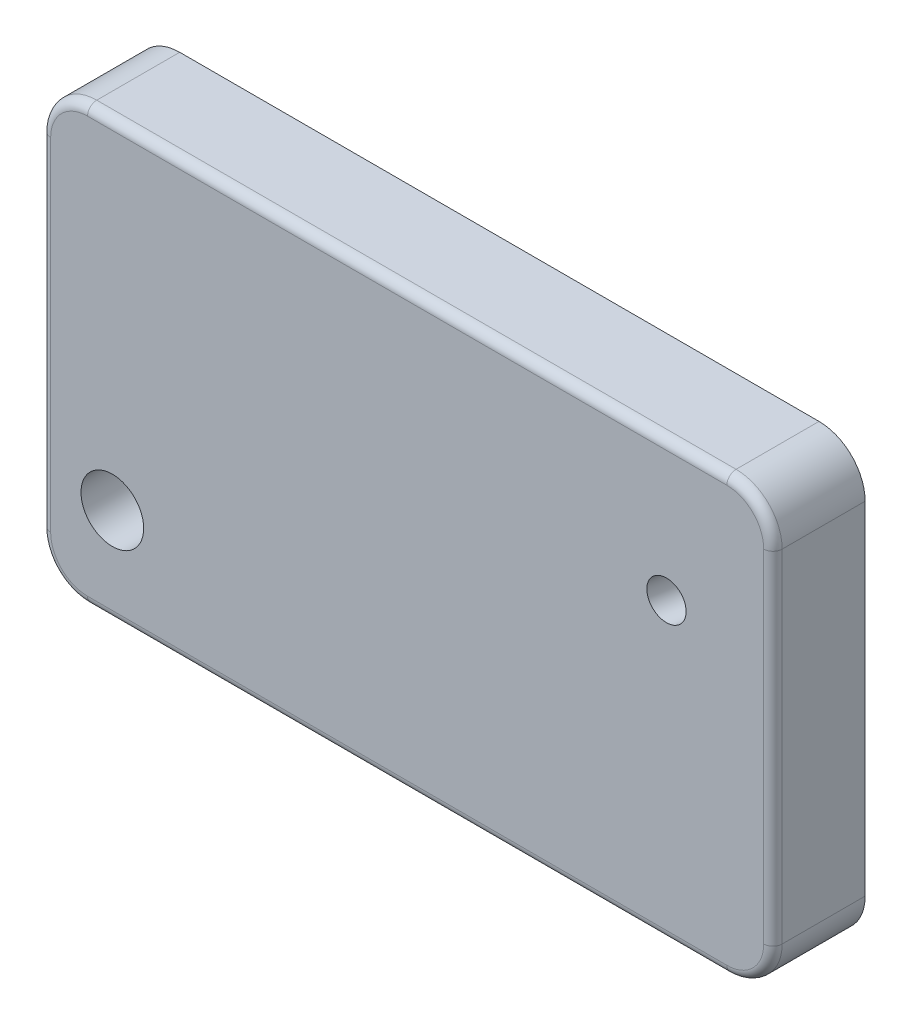
ISO-10303-21;
HEADER;
FILE_DESCRIPTION(('STEP AP214'),'2;1');
FILE_NAME('part.step','',(''),(''),'','','');
FILE_SCHEMA(('AUTOMOTIVE_DESIGN { 1 0 10303 214 1 1 1 1 }'));
ENDSEC;
DATA;
#1=APPLICATION_CONTEXT('core data for automotive mechanical design processes');
#2=APPLICATION_PROTOCOL_DEFINITION('international standard','automotive_design',2000,#1);
#3=PRODUCT_CONTEXT('',#1,'mechanical');
#4=PRODUCT('Part','Part','',(#3));
#5=PRODUCT_RELATED_PRODUCT_CATEGORY('part','',(#4));
#6=PRODUCT_DEFINITION_FORMATION('','',#4);
#7=PRODUCT_DEFINITION_CONTEXT('part definition',#1,'design');
#8=PRODUCT_DEFINITION('design','',#6,#7);
#9=PRODUCT_DEFINITION_SHAPE('','',#8);
#10=(LENGTH_UNIT() NAMED_UNIT(*) SI_UNIT(.MILLI.,.METRE.));
#11=(NAMED_UNIT(*) PLANE_ANGLE_UNIT() SI_UNIT($,.RADIAN.));
#12=(NAMED_UNIT(*) SI_UNIT($,.STERADIAN.) SOLID_ANGLE_UNIT());
#13=UNCERTAINTY_MEASURE_WITH_UNIT(LENGTH_MEASURE(1.E-05),#10,'distance_accuracy_value','');
#14=(GEOMETRIC_REPRESENTATION_CONTEXT(3) GLOBAL_UNCERTAINTY_ASSIGNED_CONTEXT((#13)) GLOBAL_UNIT_ASSIGNED_CONTEXT((#10,
#11,#12)) REPRESENTATION_CONTEXT('',''));
#15=CARTESIAN_POINT('',(0.,0.,0.));
#16=DIRECTION('',(0.,0.,1.));
#17=DIRECTION('',(1.,0.,0.));
#18=AXIS2_PLACEMENT_3D('',#15,#16,#17);
#19=CARTESIAN_POINT('',(0.,0.,0.));
#20=DIRECTION('',(0.,0.,1.));
#21=DIRECTION('',(1.,0.,0.));
#22=AXIS2_PLACEMENT_3D('',#19,#20,#21);
#23=PLANE('',#22);
#24=DIRECTION('',(-1.,0.,0.));
#25=VECTOR('',#24,1.);
#26=CARTESIAN_POINT('',(41.6731279707496,-2.92032989690722,0.));
#27=LINE('',#26,#25);
#28=CARTESIAN_POINT('',(41.6731279707496,-2.92032989690722,0.));
#29=VERTEX_POINT('',#28);
#30=CARTESIAN_POINT('',(24.7071279707496,-2.92032989690722,0.));
#31=VERTEX_POINT('',#30);
#32=EDGE_CURVE('E241',#29,#31,#27,.T.);
#33=ORIENTED_EDGE('',*,*,#32,.F.);
#34=DIRECTION('',(0.,1.,0.));
#35=VECTOR('',#34,1.);
#36=CARTESIAN_POINT('',(41.6731279707496,-2.92032989690722,0.));
#37=LINE('',#36,#35);
#38=CARTESIAN_POINT('',(41.6731279707496,17.0796701030928,0.));
#39=VERTEX_POINT('',#38);
#40=EDGE_CURVE('E265',#29,#39,#37,.T.);
#41=ORIENTED_EDGE('',*,*,#40,.T.);
#42=DIRECTION('',(-1.,0.,0.));
#43=VECTOR('',#42,1.);
#44=CARTESIAN_POINT('',(41.6731279707496,17.0796701030928,0.));
#45=LINE('',#44,#43);
#46=CARTESIAN_POINT('',(24.7071279707496,17.0796701030928,0.));
#47=VERTEX_POINT('',#46);
#48=EDGE_CURVE('E252',#39,#47,#45,.T.);
#49=ORIENTED_EDGE('',*,*,#48,.T.);
#50=DIRECTION('',(0.,1.,0.));
#51=VECTOR('',#50,1.);
#52=CARTESIAN_POINT('',(24.7071279707496,-2.92032989690722,0.));
#53=LINE('',#52,#51);
#54=EDGE_CURVE('E261',#31,#47,#53,.T.);
#55=ORIENTED_EDGE('',*,*,#54,.F.);
#56=EDGE_LOOP('',(#33,#41,#49,#55));
#57=FACE_BOUND('',#56,.T.);
#58=DIRECTION('',(0.,1.,0.));
#59=VECTOR('',#58,1.);
#60=CARTESIAN_POINT('',(-36.3824879725086,0.,0.));
#61=LINE('',#60,#59);
#62=CARTESIAN_POINT('',(-36.3824879725086,-4.37131480412374,0.));
#63=VERTEX_POINT('',#62);
#64=CARTESIAN_POINT('',(-36.3824879725086,17.0796701030928,0.));
#65=VERTEX_POINT('',#64);
#66=EDGE_CURVE('E215',#63,#65,#61,.T.);
#67=ORIENTED_EDGE('',*,*,#66,.T.);
#68=CARTESIAN_POINT('',(-31.3824879725086,17.0796701030928,0.));
#69=DIRECTION('',(0.,0.,1.));
#70=DIRECTION('',(1.,0.,0.));
#71=AXIS2_PLACEMENT_3D('',#68,#69,#70);
#72=CIRCLE('',#71,5.);
#73=CARTESIAN_POINT('',(-31.3824879725086,22.0796701030928,0.));
#74=VERTEX_POINT('',#73);
#75=EDGE_CURVE('E289',#65,#74,#72,.F.);
#76=ORIENTED_EDGE('',*,*,#75,.T.);
#77=DIRECTION('',(1.,0.,0.));
#78=VECTOR('',#77,1.);
#79=CARTESIAN_POINT('',(-49.3824879725086,22.0796701030928,0.));
#80=LINE('',#79,#78);
#81=CARTESIAN_POINT('',(37.9798903107861,22.0796701030928,0.));
#82=VERTEX_POINT('',#81);
#83=EDGE_CURVE('E273',#74,#82,#80,.T.);
#84=ORIENTED_EDGE('',*,*,#83,.T.);
#85=CARTESIAN_POINT('',(37.9798903107861,17.0796701030928,0.));
#86=DIRECTION('',(0.,0.,1.));
#87=DIRECTION('',(1.,0.,0.));
#88=AXIS2_PLACEMENT_3D('',#85,#86,#87);
#89=CIRCLE('',#88,5.);
#90=CARTESIAN_POINT('',(42.9798903107861,17.0796701030928,0.));
#91=VERTEX_POINT('',#90);
#92=EDGE_CURVE('E286',#82,#91,#89,.F.);
#93=ORIENTED_EDGE('',*,*,#92,.T.);
#94=DIRECTION('',(0.,-1.,0.));
#95=VECTOR('',#94,1.);
#96=CARTESIAN_POINT('',(42.9798903107861,22.0796701030928,0.));
#97=LINE('',#96,#95);
#98=CARTESIAN_POINT('',(42.9798903107861,-20.0233148041237,0.));
#99=VERTEX_POINT('',#98);
#100=EDGE_CURVE('E269',#91,#99,#97,.T.);
#101=ORIENTED_EDGE('',*,*,#100,.T.);
#102=CARTESIAN_POINT('',(37.9798903107861,-20.0233148041237,0.));
#103=DIRECTION('',(0.,0.,1.));
#104=DIRECTION('',(1.,0.,0.));
#105=AXIS2_PLACEMENT_3D('',#102,#103,#104);
#106=CIRCLE('',#105,5.);
#107=CARTESIAN_POINT('',(37.9798903107861,-25.0233148041237,0.));
#108=VERTEX_POINT('',#107);
#109=EDGE_CURVE('E283',#99,#108,#106,.F.);
#110=ORIENTED_EDGE('',*,*,#109,.T.);
#111=DIRECTION('',(-1.,0.,0.));
#112=VECTOR('',#111,1.);
#113=CARTESIAN_POINT('',(0.,-25.0233148041237,0.));
#114=LINE('',#113,#112);
#115=CARTESIAN_POINT('',(-15.7304879725086,-25.0233148041237,0.));
#116=VERTEX_POINT('',#115);
#117=EDGE_CURVE('E218',#108,#116,#114,.T.);
#118=ORIENTED_EDGE('',*,*,#117,.T.);
#119=CARTESIAN_POINT('',(-15.7304879725086,-20.0233148041237,0.));
#120=DIRECTION('',(0.,0.,-1.));
#121=DIRECTION('',(1.,0.,0.));
#122=AXIS2_PLACEMENT_3D('',#119,#120,#121);
#123=CIRCLE('',#122,5.);
#124=CARTESIAN_POINT('',(-10.7304879725086,-20.0233148041237,0.));
#125=VERTEX_POINT('',#124);
#126=EDGE_CURVE('E200',#125,#116,#123,.T.);
#127=ORIENTED_EDGE('',*,*,#126,.F.);
#128=DIRECTION('',(0.,-1.,0.));
#129=VECTOR('',#128,1.);
#130=CARTESIAN_POINT('',(-10.7304879725086,-20.0233148041237,0.));
#131=LINE('',#130,#129);
#132=CARTESIAN_POINT('',(-10.7304879725086,-4.37131480412374,0.));
#133=VERTEX_POINT('',#132);
#134=EDGE_CURVE('E430',#133,#125,#131,.T.);
#135=ORIENTED_EDGE('',*,*,#134,.F.);
#136=CARTESIAN_POINT('',(-15.7304879725086,-4.37131480412371,0.));
#137=DIRECTION('',(0.,0.,-1.));
#138=DIRECTION('',(-1.,0.,0.));
#139=AXIS2_PLACEMENT_3D('',#136,#137,#138);
#140=CIRCLE('',#139,5.);
#141=CARTESIAN_POINT('',(-15.7304879725086,0.628685195876293,0.));
#142=VERTEX_POINT('',#141);
#143=EDGE_CURVE('E426',#142,#133,#140,.T.);
#144=ORIENTED_EDGE('',*,*,#143,.F.);
#145=DIRECTION('',(1.,0.,0.));
#146=VECTOR('',#145,1.);
#147=CARTESIAN_POINT('',(-31.3824879725086,0.628685195876294,0.));
#148=LINE('',#147,#146);
#149=CARTESIAN_POINT('',(-31.3824879725086,0.628685195876294,0.));
#150=VERTEX_POINT('',#149);
#151=EDGE_CURVE('E422',#150,#142,#148,.T.);
#152=ORIENTED_EDGE('',*,*,#151,.F.);
#153=CARTESIAN_POINT('',(-31.3824879725086,-4.37131480412371,0.));
#154=DIRECTION('',(0.,0.,-1.));
#155=DIRECTION('',(-1.,0.,0.));
#156=AXIS2_PLACEMENT_3D('',#153,#154,#155);
#157=CIRCLE('',#156,5.);
#158=EDGE_CURVE('E402',#63,#150,#157,.T.);
#159=ORIENTED_EDGE('',*,*,#158,.F.);
#160=EDGE_LOOP('',(#67,#76,#84,#93,#101,#110,#118,#127,#135,#144,#152,#159));
#161=FACE_BOUND('',#160,.T.);
#162=ADVANCED_FACE('F43',(#57,#161),#23,.F.);
#163=CARTESIAN_POINT('',(-49.3824879725086,22.0796701030928,10.));
#164=DIRECTION('',(0.,1.,0.));
#165=DIRECTION('',(0.,0.,1.));
#166=AXIS2_PLACEMENT_3D('',#163,#164,#165);
#167=PLANE('',#166);
#168=DIRECTION('',(0.,0.,-1.));
#169=VECTOR('',#168,1.);
#170=CARTESIAN_POINT('',(-31.3824879725086,22.0796701030928,10.));
#171=LINE('',#170,#169);
#172=CARTESIAN_POINT('',(-31.3824879725086,22.0796701030928,9.));
#173=VERTEX_POINT('',#172);
#174=EDGE_CURVE('E295',#74,#173,#171,.F.);
#175=ORIENTED_EDGE('',*,*,#174,.T.);
#176=DIRECTION('',(1.,0.,0.));
#177=VECTOR('',#176,1.);
#178=CARTESIAN_POINT('',(-49.3824879725086,22.0796701030928,9.));
#179=LINE('',#178,#177);
#180=CARTESIAN_POINT('',(37.9798903107861,22.0796701030928,9.));
#181=VERTEX_POINT('',#180);
#182=EDGE_CURVE('E11',#173,#181,#179,.T.);
#183=ORIENTED_EDGE('',*,*,#182,.T.);
#184=DIRECTION('',(0.,0.,-1.));
#185=VECTOR('',#184,1.);
#186=CARTESIAN_POINT('',(37.9798903107861,22.0796701030928,10.));
#187=LINE('',#186,#185);
#188=EDGE_CURVE('E292',#181,#82,#187,.T.);
#189=ORIENTED_EDGE('',*,*,#188,.T.);
#190=ORIENTED_EDGE('',*,*,#83,.F.);
#191=EDGE_LOOP('',(#175,#183,#189,#190));
#192=FACE_BOUND('',#191,.T.);
#193=ADVANCED_FACE('F494',(#192),#167,.T.);
#194=CARTESIAN_POINT('',(0.,0.,10.));
#195=DIRECTION('',(0.,0.,1.));
#196=DIRECTION('',(1.,0.,0.));
#197=AXIS2_PLACEMENT_3D('',#194,#195,#196);
#198=PLANE('',#197);
#199=DIRECTION('',(1.,0.,0.));
#200=VECTOR('',#199,1.);
#201=CARTESIAN_POINT('',(0.,21.0796701030928,10.));
#202=LINE('',#201,#200);
#203=CARTESIAN_POINT('',(37.9798903107861,21.0796701030928,10.));
#204=VERTEX_POINT('',#203);
#205=CARTESIAN_POINT('',(-31.3824879725086,21.0796701030928,10.));
#206=VERTEX_POINT('',#205);
#207=EDGE_CURVE('E313',#204,#206,#202,.F.);
#208=ORIENTED_EDGE('',*,*,#207,.T.);
#209=CARTESIAN_POINT('',(-31.3824879725086,17.0796701030928,10.));
#210=DIRECTION('',(0.,0.,1.));
#211=DIRECTION('',(1.,0.,0.));
#212=AXIS2_PLACEMENT_3D('',#209,#210,#211);
#213=CIRCLE('',#212,4.);
#214=CARTESIAN_POINT('',(-35.3824879725086,17.0796701030928,10.));
#215=VERTEX_POINT('',#214);
#216=EDGE_CURVE('E334',#206,#215,#213,.T.);
#217=ORIENTED_EDGE('',*,*,#216,.T.);
#218=DIRECTION('',(0.,1.,0.));
#219=VECTOR('',#218,1.);
#220=CARTESIAN_POINT('',(-35.3824879725086,0.,10.));
#221=LINE('',#220,#219);
#222=CARTESIAN_POINT('',(-35.3824879725086,-20.0233148041237,10.));
#223=VERTEX_POINT('',#222);
#224=EDGE_CURVE('E331',#215,#223,#221,.F.);
#225=ORIENTED_EDGE('',*,*,#224,.T.);
#226=CARTESIAN_POINT('',(-31.3824879725086,-20.0233148041237,10.));
#227=DIRECTION('',(0.,0.,1.));
#228=DIRECTION('',(1.,0.,0.));
#229=AXIS2_PLACEMENT_3D('',#226,#227,#228);
#230=CIRCLE('',#229,4.);
#231=CARTESIAN_POINT('',(-31.3824879725086,-24.0233148041237,10.));
#232=VERTEX_POINT('',#231);
#233=EDGE_CURVE('E328',#223,#232,#230,.T.);
#234=ORIENTED_EDGE('',*,*,#233,.T.);
#235=DIRECTION('',(-1.,0.,0.));
#236=VECTOR('',#235,1.);
#237=CARTESIAN_POINT('',(0.,-24.0233148041237,10.));
#238=LINE('',#237,#236);
#239=CARTESIAN_POINT('',(37.9798903107861,-24.0233148041237,10.));
#240=VERTEX_POINT('',#239);
#241=EDGE_CURVE('E325',#232,#240,#238,.F.);
#242=ORIENTED_EDGE('',*,*,#241,.T.);
#243=CARTESIAN_POINT('',(37.9798903107861,-20.0233148041237,10.));
#244=DIRECTION('',(0.,0.,1.));
#245=DIRECTION('',(1.,0.,0.));
#246=AXIS2_PLACEMENT_3D('',#243,#244,#245);
#247=CIRCLE('',#246,4.);
#248=CARTESIAN_POINT('',(41.9798903107861,-20.0233148041237,10.));
#249=VERTEX_POINT('',#248);
#250=EDGE_CURVE('E322',#240,#249,#247,.T.);
#251=ORIENTED_EDGE('',*,*,#250,.T.);
#252=DIRECTION('',(0.,-1.,0.));
#253=VECTOR('',#252,1.);
#254=CARTESIAN_POINT('',(41.9798903107861,0.,10.));
#255=LINE('',#254,#253);
#256=CARTESIAN_POINT('',(41.9798903107861,17.0796701030928,10.));
#257=VERTEX_POINT('',#256);
#258=EDGE_CURVE('E319',#249,#257,#255,.F.);
#259=ORIENTED_EDGE('',*,*,#258,.T.);
#260=CARTESIAN_POINT('',(37.9798903107861,17.0796701030928,10.));
#261=DIRECTION('',(0.,0.,1.));
#262=DIRECTION('',(1.,0.,0.));
#263=AXIS2_PLACEMENT_3D('',#260,#261,#262);
#264=CIRCLE('',#263,4.);
#265=EDGE_CURVE('E316',#257,#204,#264,.T.);
#266=ORIENTED_EDGE('',*,*,#265,.T.);
#267=EDGE_LOOP('',(#208,#217,#225,#234,#242,#251,#259,#266));
#268=FACE_BOUND('',#267,.T.);
#269=CARTESIAN_POINT('',(-28.6924879725086,-14.6103298969072,10.));
#270=DIRECTION('',(0.,0.,1.));
#271=DIRECTION('',(1.,0.,0.));
#272=AXIS2_PLACEMENT_3D('',#269,#270,#271);
#273=CIRCLE('',#272,3.4);
#274=CARTESIAN_POINT('',(-25.2924879725086,-14.6103298969072,10.));
#275=VERTEX_POINT('',#274);
#276=EDGE_CURVE('E389',#275,#275,#273,.T.);
#277=ORIENTED_EDGE('',*,*,#276,.F.);
#278=EDGE_LOOP('',(#277));
#279=FACE_BOUND('',#278,.T.);
#280=CARTESIAN_POINT('',(31.426858163665,6.9926873857404,10.));
#281=DIRECTION('',(0.,0.,1.));
#282=DIRECTION('',(1.,0.,0.));
#283=AXIS2_PLACEMENT_3D('',#280,#281,#282);
#284=ELLIPSE('',#283,2.13239588496006,2.1);
#285=CARTESIAN_POINT('',(33.559254048625,6.9926873857404,10.));
#286=VERTEX_POINT('',#285);
#287=EDGE_CURVE('E233',#286,#286,#284,.T.);
#288=ORIENTED_EDGE('',*,*,#287,.F.);
#289=EDGE_LOOP('',(#288));
#290=FACE_BOUND('',#289,.T.);
#291=ADVANCED_FACE('F519',(#268,#279,#290),#198,.T.);
#292=CARTESIAN_POINT('',(42.9798903107861,22.0796701030928,10.));
#293=DIRECTION('',(1.,0.,0.));
#294=DIRECTION('',(0.,1.,0.));
#295=AXIS2_PLACEMENT_3D('',#292,#293,#294);
#296=PLANE('',#295);
#297=DIRECTION('',(0.,0.,-1.));
#298=VECTOR('',#297,1.);
#299=CARTESIAN_POINT('',(42.9798903107861,17.0796701030928,10.));
#300=LINE('',#299,#298);
#301=CARTESIAN_POINT('',(42.9798903107861,17.0796701030928,9.));
#302=VERTEX_POINT('',#301);
#303=EDGE_CURVE('E301',#91,#302,#300,.F.);
#304=ORIENTED_EDGE('',*,*,#303,.T.);
#305=DIRECTION('',(0.,-1.,0.));
#306=VECTOR('',#305,1.);
#307=CARTESIAN_POINT('',(42.9798903107861,22.0796701030928,9.));
#308=LINE('',#307,#306);
#309=CARTESIAN_POINT('',(42.9798903107861,-20.0233148041237,9.));
#310=VERTEX_POINT('',#309);
#311=EDGE_CURVE('E354',#302,#310,#308,.T.);
#312=ORIENTED_EDGE('',*,*,#311,.T.);
#313=DIRECTION('',(0.,0.,-1.));
#314=VECTOR('',#313,1.);
#315=CARTESIAN_POINT('',(42.9798903107861,-20.0233148041237,10.));
#316=LINE('',#315,#314);
#317=EDGE_CURVE('E298',#310,#99,#316,.T.);
#318=ORIENTED_EDGE('',*,*,#317,.T.);
#319=ORIENTED_EDGE('',*,*,#100,.F.);
#320=EDGE_LOOP('',(#304,#312,#318,#319));
#321=FACE_BOUND('',#320,.T.);
#322=ADVANCED_FACE('F498',(#321),#296,.T.);
#323=CARTESIAN_POINT('',(24.7071279707496,-2.92032989690722,-2.9915635546997));
#324=DIRECTION('',(-0.173648177666924,0.,0.984807753012209));
#325=DIRECTION('',(0.984807753012209,0.,0.173648177666924));
#326=AXIS2_PLACEMENT_3D('',#323,#324,#325);
#327=PLANE('',#326);
#328=CARTESIAN_POINT('',(33.4459217196861,6.9926873857404,-1.45067843791577));
#329=DIRECTION('',(0.173648177666924,0.,-0.984807753012209));
#330=DIRECTION('',(-0.984807753012209,0.,-0.173648177666924));
#331=AXIS2_PLACEMENT_3D('',#328,#329,#330);
#332=CIRCLE('',#331,2.1);
#333=CARTESIAN_POINT('',(31.3778254383605,6.9926873857404,-1.81533961101631));
#334=VERTEX_POINT('',#333);
#335=EDGE_CURVE('E229',#334,#334,#332,.T.);
#336=ORIENTED_EDGE('',*,*,#335,.F.);
#337=EDGE_LOOP('',(#336));
#338=FACE_BOUND('',#337,.T.);
#339=DIRECTION('',(0.984807753012209,0.,0.173648177666924));
#340=VECTOR('',#339,1.);
#341=CARTESIAN_POINT('',(24.7071279707496,17.0796701030928,-2.9915635546997));
#342=LINE('',#341,#340);
#343=CARTESIAN_POINT('',(24.7071279707496,17.0796701030928,-2.9915635546997));
#344=VERTEX_POINT('',#343);
#345=EDGE_CURVE('E237',#344,#39,#342,.T.);
#346=ORIENTED_EDGE('',*,*,#345,.T.);
#347=ORIENTED_EDGE('',*,*,#40,.F.);
#348=DIRECTION('',(0.984807753012209,0.,0.173648177666924));
#349=VECTOR('',#348,1.);
#350=CARTESIAN_POINT('',(24.7071279707496,-2.92032989690722,-2.9915635546997));
#351=LINE('',#350,#349);
#352=CARTESIAN_POINT('',(24.7071279707496,-2.92032989690722,-2.9915635546997));
#353=VERTEX_POINT('',#352);
#354=EDGE_CURVE('E238',#353,#29,#351,.T.);
#355=ORIENTED_EDGE('',*,*,#354,.F.);
#356=DIRECTION('',(0.,1.,0.));
#357=VECTOR('',#356,1.);
#358=CARTESIAN_POINT('',(24.7071279707496,-2.92032989690722,-2.9915635546997));
#359=LINE('',#358,#357);
#360=EDGE_CURVE('E248',#353,#344,#359,.T.);
#361=ORIENTED_EDGE('',*,*,#360,.T.);
#362=EDGE_LOOP('',(#346,#347,#355,#361));
#363=FACE_BOUND('',#362,.T.);
#364=ADVANCED_FACE('F526',(#338,#363),#327,.F.);
#365=CARTESIAN_POINT('',(24.7071279707496,-2.92032989690722,0.));
#366=DIRECTION('',(1.,0.,0.));
#367=DIRECTION('',(0.,0.,-1.));
#368=AXIS2_PLACEMENT_3D('',#365,#366,#367);
#369=PLANE('',#368);
#370=DIRECTION('',(0.,0.,-1.));
#371=VECTOR('',#370,1.);
#372=CARTESIAN_POINT('',(24.7071279707496,17.0796701030928,0.));
#373=LINE('',#372,#371);
#374=EDGE_CURVE('E242',#47,#344,#373,.T.);
#375=ORIENTED_EDGE('',*,*,#374,.T.);
#376=ORIENTED_EDGE('',*,*,#360,.F.);
#377=DIRECTION('',(0.,0.,-1.));
#378=VECTOR('',#377,1.);
#379=CARTESIAN_POINT('',(24.7071279707496,-2.92032989690722,0.));
#380=LINE('',#379,#378);
#381=EDGE_CURVE('E245',#31,#353,#380,.T.);
#382=ORIENTED_EDGE('',*,*,#381,.F.);
#383=ORIENTED_EDGE('',*,*,#54,.T.);
#384=EDGE_LOOP('',(#375,#376,#382,#383));
#385=FACE_BOUND('',#384,.T.);
#386=ADVANCED_FACE('F531',(#385),#369,.F.);
#387=CARTESIAN_POINT('',(0.,-2.92032989690722,0.));
#388=DIRECTION('',(0.,1.,0.));
#389=DIRECTION('',(0.,0.,1.));
#390=AXIS2_PLACEMENT_3D('',#387,#388,#389);
#391=PLANE('',#390);
#392=ORIENTED_EDGE('',*,*,#354,.T.);
#393=ORIENTED_EDGE('',*,*,#32,.T.);
#394=ORIENTED_EDGE('',*,*,#381,.T.);
#395=EDGE_LOOP('',(#392,#393,#394));
#396=FACE_BOUND('',#395,.T.);
#397=ADVANCED_FACE('F556',(#396),#391,.F.);
#398=CARTESIAN_POINT('',(0.,17.0796701030928,0.));
#399=DIRECTION('',(0.,1.,0.));
#400=DIRECTION('',(0.,0.,1.));
#401=AXIS2_PLACEMENT_3D('',#398,#399,#400);
#402=PLANE('',#401);
#403=ORIENTED_EDGE('',*,*,#345,.F.);
#404=ORIENTED_EDGE('',*,*,#374,.F.);
#405=ORIENTED_EDGE('',*,*,#48,.F.);
#406=EDGE_LOOP('',(#403,#404,#405));
#407=FACE_BOUND('',#406,.T.);
#408=ADVANCED_FACE('F544',(#407),#402,.T.);
#409=CARTESIAN_POINT('',(33.4459217196861,6.9926873857404,-1.45067843791577));
#410=DIRECTION('',(0.173648177666924,0.,-0.984807753012209));
#411=DIRECTION('',(-0.984807753012209,0.,-0.173648177666924));
#412=AXIS2_PLACEMENT_3D('',#409,#410,#411);
#413=CYLINDRICAL_SURFACE('',#412,2.1);
#414=ORIENTED_EDGE('',*,*,#287,.T.);
#415=EDGE_LOOP('',(#414));
#416=FACE_BOUND('',#415,.T.);
#417=ORIENTED_EDGE('',*,*,#335,.T.);
#418=EDGE_LOOP('',(#417));
#419=FACE_BOUND('',#418,.T.);
#420=ADVANCED_FACE('F541',(#416,#419),#413,.F.);
#421=CARTESIAN_POINT('',(0.,-25.0233148041237,10.));
#422=DIRECTION('',(0.,-1.,0.));
#423=DIRECTION('',(0.,0.,-1.));
#424=AXIS2_PLACEMENT_3D('',#421,#422,#423);
#425=PLANE('',#424);
#426=DIRECTION('',(0.,0.,-1.));
#427=VECTOR('',#426,1.);
#428=CARTESIAN_POINT('',(37.9798903107861,-25.0233148041237,10.));
#429=LINE('',#428,#427);
#430=CARTESIAN_POINT('',(37.9798903107861,-25.0233148041237,9.));
#431=VERTEX_POINT('',#430);
#432=EDGE_CURVE('E307',#108,#431,#429,.F.);
#433=ORIENTED_EDGE('',*,*,#432,.T.);
#434=DIRECTION('',(-1.,0.,0.));
#435=VECTOR('',#434,1.);
#436=CARTESIAN_POINT('',(0.,-25.0233148041237,9.));
#437=LINE('',#436,#435);
#438=CARTESIAN_POINT('',(-31.3824879725086,-25.0233148041237,9.));
#439=VERTEX_POINT('',#438);
#440=EDGE_CURVE('E348',#431,#439,#437,.T.);
#441=ORIENTED_EDGE('',*,*,#440,.T.);
#442=DIRECTION('',(0.,0.,-1.));
#443=VECTOR('',#442,1.);
#444=CARTESIAN_POINT('',(-31.3824879725086,-25.0233148041237,10.));
#445=LINE('',#444,#443);
#446=CARTESIAN_POINT('',(-31.3824879725086,-25.0233148041237,-20.));
#447=VERTEX_POINT('',#446);
#448=EDGE_CURVE('E304',#439,#447,#445,.T.);
#449=ORIENTED_EDGE('',*,*,#448,.T.);
#450=DIRECTION('',(-1.,0.,0.));
#451=VECTOR('',#450,1.);
#452=CARTESIAN_POINT('',(-36.3824879725086,-25.0233148041237,-20.));
#453=LINE('',#452,#451);
#454=CARTESIAN_POINT('',(-15.7304879725086,-25.0233148041237,-20.));
#455=VERTEX_POINT('',#454);
#456=EDGE_CURVE('E416',#455,#447,#453,.T.);
#457=ORIENTED_EDGE('',*,*,#456,.F.);
#458=DIRECTION('',(0.,0.,1.));
#459=VECTOR('',#458,1.);
#460=CARTESIAN_POINT('',(-15.7304879725086,-25.0233148041237,-20.));
#461=LINE('',#460,#459);
#462=EDGE_CURVE('E419',#455,#116,#461,.T.);
#463=ORIENTED_EDGE('',*,*,#462,.T.);
#464=ORIENTED_EDGE('',*,*,#117,.F.);
#465=EDGE_LOOP('',(#433,#441,#449,#457,#463,#464));
#466=FACE_BOUND('',#465,.T.);
#467=ADVANCED_FACE('F467',(#466),#425,.T.);
#468=CARTESIAN_POINT('',(-36.3824879725086,0.,10.));
#469=DIRECTION('',(-1.,0.,0.));
#470=DIRECTION('',(0.,0.,1.));
#471=AXIS2_PLACEMENT_3D('',#468,#469,#470);
#472=PLANE('',#471);
#473=DIRECTION('',(0.,0.,-1.));
#474=VECTOR('',#473,1.);
#475=CARTESIAN_POINT('',(-36.3824879725086,-20.0233148041237,10.));
#476=LINE('',#475,#474);
#477=CARTESIAN_POINT('',(-36.3824879725086,-20.0233148041237,-20.));
#478=VERTEX_POINT('',#477);
#479=CARTESIAN_POINT('',(-36.3824879725086,-20.0233148041237,9.));
#480=VERTEX_POINT('',#479);
#481=EDGE_CURVE('E277',#478,#480,#476,.F.);
#482=ORIENTED_EDGE('',*,*,#481,.T.);
#483=DIRECTION('',(0.,1.,0.));
#484=VECTOR('',#483,1.);
#485=CARTESIAN_POINT('',(-36.3824879725086,0.,9.));
#486=LINE('',#485,#484);
#487=CARTESIAN_POINT('',(-36.3824879725086,17.0796701030928,9.));
#488=VERTEX_POINT('',#487);
#489=EDGE_CURVE('E342',#480,#488,#486,.T.);
#490=ORIENTED_EDGE('',*,*,#489,.T.);
#491=DIRECTION('',(0.,0.,-1.));
#492=VECTOR('',#491,1.);
#493=CARTESIAN_POINT('',(-36.3824879725086,17.0796701030928,10.));
#494=LINE('',#493,#492);
#495=EDGE_CURVE('E280',#488,#65,#494,.T.);
#496=ORIENTED_EDGE('',*,*,#495,.T.);
#497=ORIENTED_EDGE('',*,*,#66,.F.);
#498=DIRECTION('',(0.,0.,1.));
#499=VECTOR('',#498,1.);
#500=CARTESIAN_POINT('',(-36.3824879725086,-4.37131480412374,-20.));
#501=LINE('',#500,#499);
#502=CARTESIAN_POINT('',(-36.3824879725086,-4.37131480412374,-20.));
#503=VERTEX_POINT('',#502);
#504=EDGE_CURVE('E206',#503,#63,#501,.T.);
#505=ORIENTED_EDGE('',*,*,#504,.F.);
#506=DIRECTION('',(0.,1.,0.));
#507=VECTOR('',#506,1.);
#508=CARTESIAN_POINT('',(-36.3824879725086,-25.0233148041237,-20.));
#509=LINE('',#508,#507);
#510=EDGE_CURVE('E187',#478,#503,#509,.T.);
#511=ORIENTED_EDGE('',*,*,#510,.F.);
#512=EDGE_LOOP('',(#482,#490,#496,#497,#505,#511));
#513=FACE_BOUND('',#512,.T.);
#514=ADVANCED_FACE('F213',(#513),#472,.T.);
#515=CARTESIAN_POINT('',(-31.3824879725086,-4.37131480412371,-20.));
#516=DIRECTION('',(0.,0.,1.));
#517=DIRECTION('',(1.,0.,0.));
#518=AXIS2_PLACEMENT_3D('',#515,#516,#517);
#519=CYLINDRICAL_SURFACE('',#518,5.);
#520=ORIENTED_EDGE('',*,*,#158,.T.);
#521=DIRECTION('',(0.,0.,1.));
#522=VECTOR('',#521,1.);
#523=CARTESIAN_POINT('',(-31.3824879725086,0.628685195876294,-20.));
#524=LINE('',#523,#522);
#525=CARTESIAN_POINT('',(-31.3824879725086,0.628685195876294,-20.));
#526=VERTEX_POINT('',#525);
#527=EDGE_CURVE('E208',#526,#150,#524,.T.);
#528=ORIENTED_EDGE('',*,*,#527,.F.);
#529=CARTESIAN_POINT('',(-31.3824879725086,-4.37131480412371,-20.));
#530=DIRECTION('',(0.,0.,-1.));
#531=DIRECTION('',(-1.,0.,0.));
#532=AXIS2_PLACEMENT_3D('',#529,#530,#531);
#533=CIRCLE('',#532,5.);
#534=EDGE_CURVE('E191',#503,#526,#533,.T.);
#535=ORIENTED_EDGE('',*,*,#534,.F.);
#536=ORIENTED_EDGE('',*,*,#504,.T.);
#537=EDGE_LOOP('',(#520,#528,#535,#536));
#538=FACE_BOUND('',#537,.T.);
#539=ADVANCED_FACE('F205',(#538),#519,.T.);
#540=CARTESIAN_POINT('',(-31.3824879725086,0.628685195876294,-20.));
#541=DIRECTION('',(0.,-1.,0.));
#542=DIRECTION('',(1.,0.,0.));
#543=AXIS2_PLACEMENT_3D('',#540,#541,#542);
#544=PLANE('',#543);
#545=ORIENTED_EDGE('',*,*,#151,.T.);
#546=DIRECTION('',(0.,0.,1.));
#547=VECTOR('',#546,1.);
#548=CARTESIAN_POINT('',(-15.7304879725086,0.628685195876293,-20.));
#549=LINE('',#548,#547);
#550=CARTESIAN_POINT('',(-15.7304879725086,0.628685195876293,-20.));
#551=VERTEX_POINT('',#550);
#552=EDGE_CURVE('E223',#551,#142,#549,.T.);
#553=ORIENTED_EDGE('',*,*,#552,.F.);
#554=DIRECTION('',(1.,0.,0.));
#555=VECTOR('',#554,1.);
#556=CARTESIAN_POINT('',(-31.3824879725086,0.628685195876294,-20.));
#557=LINE('',#556,#555);
#558=EDGE_CURVE('E211',#526,#551,#557,.T.);
#559=ORIENTED_EDGE('',*,*,#558,.F.);
#560=ORIENTED_EDGE('',*,*,#527,.T.);
#561=EDGE_LOOP('',(#545,#553,#559,#560));
#562=FACE_BOUND('',#561,.T.);
#563=ADVANCED_FACE('F455',(#562),#544,.F.);
#564=CARTESIAN_POINT('',(-15.7304879725086,-4.37131480412371,-20.));
#565=DIRECTION('',(0.,0.,1.));
#566=DIRECTION('',(1.,0.,0.));
#567=AXIS2_PLACEMENT_3D('',#564,#565,#566);
#568=CYLINDRICAL_SURFACE('',#567,5.);
#569=ORIENTED_EDGE('',*,*,#143,.T.);
#570=DIRECTION('',(0.,0.,1.));
#571=VECTOR('',#570,1.);
#572=CARTESIAN_POINT('',(-10.7304879725086,-4.37131480412374,-20.));
#573=LINE('',#572,#571);
#574=CARTESIAN_POINT('',(-10.7304879725086,-4.37131480412374,-20.));
#575=VERTEX_POINT('',#574);
#576=EDGE_CURVE('E444',#575,#133,#573,.T.);
#577=ORIENTED_EDGE('',*,*,#576,.F.);
#578=CARTESIAN_POINT('',(-15.7304879725086,-4.37131480412371,-20.));
#579=DIRECTION('',(0.,0.,-1.));
#580=DIRECTION('',(-1.,0.,0.));
#581=AXIS2_PLACEMENT_3D('',#578,#579,#580);
#582=CIRCLE('',#581,5.);
#583=EDGE_CURVE('E407',#551,#575,#582,.T.);
#584=ORIENTED_EDGE('',*,*,#583,.F.);
#585=ORIENTED_EDGE('',*,*,#552,.T.);
#586=EDGE_LOOP('',(#569,#577,#584,#585));
#587=FACE_BOUND('',#586,.T.);
#588=ADVANCED_FACE('F452',(#587),#568,.T.);
#589=CARTESIAN_POINT('',(-10.7304879725086,-20.0233148041237,-20.));
#590=DIRECTION('',(-1.,0.,0.));
#591=DIRECTION('',(0.,0.,1.));
#592=AXIS2_PLACEMENT_3D('',#589,#590,#591);
#593=PLANE('',#592);
#594=ORIENTED_EDGE('',*,*,#134,.T.);
#595=DIRECTION('',(0.,0.,1.));
#596=VECTOR('',#595,1.);
#597=CARTESIAN_POINT('',(-10.7304879725086,-20.0233148041237,-20.));
#598=LINE('',#597,#596);
#599=CARTESIAN_POINT('',(-10.7304879725086,-20.0233148041237,-20.));
#600=VERTEX_POINT('',#599);
#601=EDGE_CURVE('E440',#600,#125,#598,.T.);
#602=ORIENTED_EDGE('',*,*,#601,.F.);
#603=DIRECTION('',(0.,-1.,0.));
#604=VECTOR('',#603,1.);
#605=CARTESIAN_POINT('',(-10.7304879725086,-20.0233148041237,-20.));
#606=LINE('',#605,#604);
#607=EDGE_CURVE('E410',#575,#600,#606,.T.);
#608=ORIENTED_EDGE('',*,*,#607,.F.);
#609=ORIENTED_EDGE('',*,*,#576,.T.);
#610=EDGE_LOOP('',(#594,#602,#608,#609));
#611=FACE_BOUND('',#610,.T.);
#612=ADVANCED_FACE('F459',(#611),#593,.F.);
#613=CARTESIAN_POINT('',(-15.7304879725086,-20.0233148041237,-20.));
#614=DIRECTION('',(0.,0.,1.));
#615=DIRECTION('',(1.,0.,0.));
#616=AXIS2_PLACEMENT_3D('',#613,#614,#615);
#617=CYLINDRICAL_SURFACE('',#616,5.);
#618=ORIENTED_EDGE('',*,*,#126,.T.);
#619=ORIENTED_EDGE('',*,*,#462,.F.);
#620=CARTESIAN_POINT('',(-15.7304879725086,-20.0233148041237,-20.));
#621=DIRECTION('',(0.,0.,-1.));
#622=DIRECTION('',(1.,0.,0.));
#623=AXIS2_PLACEMENT_3D('',#620,#621,#622);
#624=CIRCLE('',#623,5.);
#625=EDGE_CURVE('E413',#600,#455,#624,.T.);
#626=ORIENTED_EDGE('',*,*,#625,.F.);
#627=ORIENTED_EDGE('',*,*,#601,.T.);
#628=EDGE_LOOP('',(#618,#619,#626,#627));
#629=FACE_BOUND('',#628,.T.);
#630=ADVANCED_FACE('F463',(#629),#617,.T.);
#631=CARTESIAN_POINT('',(-31.3824879725086,-4.37131480412371,-20.));
#632=DIRECTION('',(0.,0.,-1.));
#633=DIRECTION('',(-1.,0.,0.));
#634=AXIS2_PLACEMENT_3D('',#631,#632,#633);
#635=PLANE('',#634);
#636=CARTESIAN_POINT('',(-28.6924879725086,-14.6103298969072,-20.));
#637=DIRECTION('',(0.,0.,1.));
#638=DIRECTION('',(1.,0.,0.));
#639=AXIS2_PLACEMENT_3D('',#636,#637,#638);
#640=CIRCLE('',#639,3.39999999999999);
#641=CARTESIAN_POINT('',(-25.2924879725086,-14.6103298969072,-20.));
#642=VERTEX_POINT('',#641);
#643=EDGE_CURVE('E396',#642,#642,#640,.T.);
#644=ORIENTED_EDGE('',*,*,#643,.T.);
#645=EDGE_LOOP('',(#644));
#646=FACE_BOUND('',#645,.T.);
#647=ORIENTED_EDGE('',*,*,#456,.T.);
#648=CARTESIAN_POINT('',(-31.3824879725086,-20.0233148041237,-20.));
#649=DIRECTION('',(0.,0.,-1.));
#650=DIRECTION('',(-1.,0.,0.));
#651=AXIS2_PLACEMENT_3D('',#648,#649,#650);
#652=CIRCLE('',#651,5.);
#653=EDGE_CURVE('E194',#447,#478,#652,.T.);
#654=ORIENTED_EDGE('',*,*,#653,.T.);
#655=ORIENTED_EDGE('',*,*,#510,.T.);
#656=ORIENTED_EDGE('',*,*,#534,.T.);
#657=ORIENTED_EDGE('',*,*,#558,.T.);
#658=ORIENTED_EDGE('',*,*,#583,.T.);
#659=ORIENTED_EDGE('',*,*,#607,.T.);
#660=ORIENTED_EDGE('',*,*,#625,.T.);
#661=EDGE_LOOP('',(#647,#654,#655,#656,#657,#658,#659,#660));
#662=FACE_BOUND('',#661,.T.);
#663=ADVANCED_FACE('F190',(#646,#662),#635,.T.);
#664=CARTESIAN_POINT('',(-28.6924879725086,-14.6103298969072,10.));
#665=DIRECTION('',(0.,0.,1.));
#666=DIRECTION('',(1.,0.,0.));
#667=AXIS2_PLACEMENT_3D('',#664,#665,#666);
#668=CYLINDRICAL_SURFACE('',#667,3.4);
#669=ORIENTED_EDGE('',*,*,#643,.F.);
#670=EDGE_LOOP('',(#669));
#671=FACE_BOUND('',#670,.T.);
#672=ORIENTED_EDGE('',*,*,#276,.T.);
#673=EDGE_LOOP('',(#672));
#674=FACE_BOUND('',#673,.T.);
#675=ADVANCED_FACE('F511',(#671,#674),#668,.F.);
#676=CARTESIAN_POINT('',(-31.3824879725086,17.0796701030928,10.));
#677=DIRECTION('',(0.,0.,-1.));
#678=DIRECTION('',(-1.,0.,0.));
#679=AXIS2_PLACEMENT_3D('',#676,#677,#678);
#680=CYLINDRICAL_SURFACE('',#679,5.);
#681=ORIENTED_EDGE('',*,*,#495,.F.);
#682=CARTESIAN_POINT('',(-31.3824879725086,17.0796701030928,9.));
#683=DIRECTION('',(0.,0.,1.));
#684=DIRECTION('',(1.,0.,0.));
#685=AXIS2_PLACEMENT_3D('',#682,#683,#684);
#686=CIRCLE('',#685,5.);
#687=EDGE_CURVE('E338',#488,#173,#686,.F.);
#688=ORIENTED_EDGE('',*,*,#687,.T.);
#689=ORIENTED_EDGE('',*,*,#174,.F.);
#690=ORIENTED_EDGE('',*,*,#75,.F.);
#691=EDGE_LOOP('',(#681,#688,#689,#690));
#692=FACE_BOUND('',#691,.T.);
#693=ADVANCED_FACE('F491',(#692),#680,.T.);
#694=CARTESIAN_POINT('',(37.9798903107861,17.0796701030928,10.));
#695=DIRECTION('',(0.,0.,-1.));
#696=DIRECTION('',(-1.,0.,0.));
#697=AXIS2_PLACEMENT_3D('',#694,#695,#696);
#698=CYLINDRICAL_SURFACE('',#697,5.);
#699=ORIENTED_EDGE('',*,*,#188,.F.);
#700=CARTESIAN_POINT('',(37.9798903107861,17.0796701030928,9.));
#701=DIRECTION('',(0.,0.,1.));
#702=DIRECTION('',(1.,0.,0.));
#703=AXIS2_PLACEMENT_3D('',#700,#701,#702);
#704=CIRCLE('',#703,5.);
#705=EDGE_CURVE('E53',#181,#302,#704,.F.);
#706=ORIENTED_EDGE('',*,*,#705,.T.);
#707=ORIENTED_EDGE('',*,*,#303,.F.);
#708=ORIENTED_EDGE('',*,*,#92,.F.);
#709=EDGE_LOOP('',(#699,#706,#707,#708));
#710=FACE_BOUND('',#709,.T.);
#711=ADVANCED_FACE('F501',(#710),#698,.T.);
#712=CARTESIAN_POINT('',(37.9798903107861,-20.0233148041237,10.));
#713=DIRECTION('',(0.,0.,-1.));
#714=DIRECTION('',(-1.,0.,0.));
#715=AXIS2_PLACEMENT_3D('',#712,#713,#714);
#716=CYLINDRICAL_SURFACE('',#715,5.);
#717=ORIENTED_EDGE('',*,*,#317,.F.);
#718=CARTESIAN_POINT('',(37.9798903107861,-20.0233148041237,9.));
#719=DIRECTION('',(0.,0.,1.));
#720=DIRECTION('',(1.,0.,0.));
#721=AXIS2_PLACEMENT_3D('',#718,#719,#720);
#722=CIRCLE('',#721,5.);
#723=EDGE_CURVE('E351',#310,#431,#722,.F.);
#724=ORIENTED_EDGE('',*,*,#723,.T.);
#725=ORIENTED_EDGE('',*,*,#432,.F.);
#726=ORIENTED_EDGE('',*,*,#109,.F.);
#727=EDGE_LOOP('',(#717,#724,#725,#726));
#728=FACE_BOUND('',#727,.T.);
#729=ADVANCED_FACE('F503',(#728),#716,.T.);
#730=CARTESIAN_POINT('',(-31.3824879725086,-20.0233148041237,10.));
#731=DIRECTION('',(0.,0.,-1.));
#732=DIRECTION('',(-1.,0.,0.));
#733=AXIS2_PLACEMENT_3D('',#730,#731,#732);
#734=CYLINDRICAL_SURFACE('',#733,5.);
#735=ORIENTED_EDGE('',*,*,#448,.F.);
#736=CARTESIAN_POINT('',(-31.3824879725086,-20.0233148041237,9.));
#737=DIRECTION('',(0.,0.,1.));
#738=DIRECTION('',(1.,0.,0.));
#739=AXIS2_PLACEMENT_3D('',#736,#737,#738);
#740=CIRCLE('',#739,5.);
#741=EDGE_CURVE('E345',#439,#480,#740,.F.);
#742=ORIENTED_EDGE('',*,*,#741,.T.);
#743=ORIENTED_EDGE('',*,*,#481,.F.);
#744=ORIENTED_EDGE('',*,*,#653,.F.);
#745=EDGE_LOOP('',(#735,#742,#743,#744));
#746=FACE_BOUND('',#745,.T.);
#747=ADVANCED_FACE('F472',(#746),#734,.T.);
#748=CARTESIAN_POINT('',(37.9798903107861,-20.0233148041237,9.));
#749=DIRECTION('',(0.,0.,1.));
#750=DIRECTION('',(1.,0.,0.));
#751=AXIS2_PLACEMENT_3D('',#748,#749,#750);
#752=TOROIDAL_SURFACE('',#751,4.,1.);
#753=CARTESIAN_POINT('',(37.9798903107861,-24.0233148041237,9.));
#754=DIRECTION('',(-1.,0.,0.));
#755=DIRECTION('',(0.,0.,1.));
#756=AXIS2_PLACEMENT_3D('',#753,#754,#755);
#757=CIRCLE('',#756,1.);
#758=EDGE_CURVE('E380',#431,#240,#757,.T.);
#759=ORIENTED_EDGE('',*,*,#758,.F.);
#760=ORIENTED_EDGE('',*,*,#723,.F.);
#761=CARTESIAN_POINT('',(41.9798903107861,-20.0233148041237,9.));
#762=DIRECTION('',(0.,1.,0.));
#763=DIRECTION('',(0.,0.,1.));
#764=AXIS2_PLACEMENT_3D('',#761,#762,#763);
#765=CIRCLE('',#764,1.);
#766=EDGE_CURVE('E47',#249,#310,#765,.T.);
#767=ORIENTED_EDGE('',*,*,#766,.F.);
#768=ORIENTED_EDGE('',*,*,#250,.F.);
#769=EDGE_LOOP('',(#759,#760,#767,#768));
#770=FACE_BOUND('',#769,.T.);
#771=ADVANCED_FACE('F45',(#770),#752,.T.);
#772=CARTESIAN_POINT('',(41.9798903107861,22.0796701030928,9.));
#773=DIRECTION('',(0.,-1.,0.));
#774=DIRECTION('',(1.,0.,0.));
#775=AXIS2_PLACEMENT_3D('',#772,#773,#774);
#776=CYLINDRICAL_SURFACE('',#775,1.);
#777=ORIENTED_EDGE('',*,*,#766,.T.);
#778=ORIENTED_EDGE('',*,*,#311,.F.);
#779=CARTESIAN_POINT('',(41.9798903107861,17.0796701030928,9.));
#780=DIRECTION('',(0.,1.,0.));
#781=DIRECTION('',(0.,0.,1.));
#782=AXIS2_PLACEMENT_3D('',#779,#780,#781);
#783=CIRCLE('',#782,1.);
#784=EDGE_CURVE('E377',#257,#302,#783,.T.);
#785=ORIENTED_EDGE('',*,*,#784,.F.);
#786=ORIENTED_EDGE('',*,*,#258,.F.);
#787=EDGE_LOOP('',(#777,#778,#785,#786));
#788=FACE_BOUND('',#787,.T.);
#789=ADVANCED_FACE('F728',(#788),#776,.T.);
#790=CARTESIAN_POINT('',(0.,-24.0233148041237,9.));
#791=DIRECTION('',(-1.,0.,0.));
#792=DIRECTION('',(0.,0.,1.));
#793=AXIS2_PLACEMENT_3D('',#790,#791,#792);
#794=CYLINDRICAL_SURFACE('',#793,1.);
#795=ORIENTED_EDGE('',*,*,#758,.T.);
#796=ORIENTED_EDGE('',*,*,#241,.F.);
#797=CARTESIAN_POINT('',(-31.3824879725086,-24.0233148041237,9.));
#798=DIRECTION('',(-1.,0.,0.));
#799=DIRECTION('',(0.,0.,1.));
#800=AXIS2_PLACEMENT_3D('',#797,#798,#799);
#801=CIRCLE('',#800,1.);
#802=EDGE_CURVE('E373',#439,#232,#801,.T.);
#803=ORIENTED_EDGE('',*,*,#802,.F.);
#804=ORIENTED_EDGE('',*,*,#440,.F.);
#805=EDGE_LOOP('',(#795,#796,#803,#804));
#806=FACE_BOUND('',#805,.T.);
#807=ADVANCED_FACE('F737',(#806),#794,.T.);
#808=CARTESIAN_POINT('',(37.9798903107861,17.0796701030928,9.));
#809=DIRECTION('',(0.,0.,1.));
#810=DIRECTION('',(1.,0.,0.));
#811=AXIS2_PLACEMENT_3D('',#808,#809,#810);
#812=TOROIDAL_SURFACE('',#811,4.,1.);
#813=ORIENTED_EDGE('',*,*,#784,.T.);
#814=ORIENTED_EDGE('',*,*,#705,.F.);
#815=CARTESIAN_POINT('',(37.9798903107861,21.0796701030928,9.));
#816=DIRECTION('',(-1.,0.,0.));
#817=DIRECTION('',(0.,0.,1.));
#818=AXIS2_PLACEMENT_3D('',#815,#816,#817);
#819=CIRCLE('',#818,1.);
#820=EDGE_CURVE('E369',#204,#181,#819,.T.);
#821=ORIENTED_EDGE('',*,*,#820,.F.);
#822=ORIENTED_EDGE('',*,*,#265,.F.);
#823=EDGE_LOOP('',(#813,#814,#821,#822));
#824=FACE_BOUND('',#823,.T.);
#825=ADVANCED_FACE('F745',(#824),#812,.T.);
#826=CARTESIAN_POINT('',(-31.3824879725086,-20.0233148041237,9.));
#827=DIRECTION('',(0.,0.,1.));
#828=DIRECTION('',(1.,0.,0.));
#829=AXIS2_PLACEMENT_3D('',#826,#827,#828);
#830=TOROIDAL_SURFACE('',#829,4.,1.);
#831=ORIENTED_EDGE('',*,*,#802,.T.);
#832=ORIENTED_EDGE('',*,*,#233,.F.);
#833=CARTESIAN_POINT('',(-35.3824879725086,-20.0233148041237,9.));
#834=DIRECTION('',(0.,1.,0.));
#835=DIRECTION('',(0.,0.,1.));
#836=AXIS2_PLACEMENT_3D('',#833,#834,#835);
#837=CIRCLE('',#836,1.);
#838=EDGE_CURVE('E365',#480,#223,#837,.T.);
#839=ORIENTED_EDGE('',*,*,#838,.F.);
#840=ORIENTED_EDGE('',*,*,#741,.F.);
#841=EDGE_LOOP('',(#831,#832,#839,#840));
#842=FACE_BOUND('',#841,.T.);
#843=ADVANCED_FACE('F479',(#842),#830,.T.);
#844=CARTESIAN_POINT('',(-49.3824879725086,21.0796701030928,9.));
#845=DIRECTION('',(1.,0.,0.));
#846=DIRECTION('',(0.,0.,-1.));
#847=AXIS2_PLACEMENT_3D('',#844,#845,#846);
#848=CYLINDRICAL_SURFACE('',#847,1.);
#849=ORIENTED_EDGE('',*,*,#820,.T.);
#850=ORIENTED_EDGE('',*,*,#182,.F.);
#851=CARTESIAN_POINT('',(-31.3824879725086,21.0796701030928,9.));
#852=DIRECTION('',(-1.,0.,0.));
#853=DIRECTION('',(0.,0.,1.));
#854=AXIS2_PLACEMENT_3D('',#851,#852,#853);
#855=CIRCLE('',#854,1.);
#856=EDGE_CURVE('E362',#206,#173,#855,.T.);
#857=ORIENTED_EDGE('',*,*,#856,.F.);
#858=ORIENTED_EDGE('',*,*,#207,.F.);
#859=EDGE_LOOP('',(#849,#850,#857,#858));
#860=FACE_BOUND('',#859,.T.);
#861=ADVANCED_FACE('F763',(#860),#848,.T.);
#862=CARTESIAN_POINT('',(-35.3824879725086,0.,9.));
#863=DIRECTION('',(0.,1.,0.));
#864=DIRECTION('',(0.,0.,1.));
#865=AXIS2_PLACEMENT_3D('',#862,#863,#864);
#866=CYLINDRICAL_SURFACE('',#865,1.);
#867=ORIENTED_EDGE('',*,*,#838,.T.);
#868=ORIENTED_EDGE('',*,*,#224,.F.);
#869=CARTESIAN_POINT('',(-35.3824879725086,17.0796701030928,9.));
#870=DIRECTION('',(0.,1.,0.));
#871=DIRECTION('',(0.,0.,1.));
#872=AXIS2_PLACEMENT_3D('',#869,#870,#871);
#873=CIRCLE('',#872,1.);
#874=EDGE_CURVE('E359',#488,#215,#873,.T.);
#875=ORIENTED_EDGE('',*,*,#874,.F.);
#876=ORIENTED_EDGE('',*,*,#489,.F.);
#877=EDGE_LOOP('',(#867,#868,#875,#876));
#878=FACE_BOUND('',#877,.T.);
#879=ADVANCED_FACE('F483',(#878),#866,.T.);
#880=CARTESIAN_POINT('',(-31.3824879725086,17.0796701030928,9.));
#881=DIRECTION('',(0.,0.,1.));
#882=DIRECTION('',(1.,0.,0.));
#883=AXIS2_PLACEMENT_3D('',#880,#881,#882);
#884=TOROIDAL_SURFACE('',#883,4.,1.);
#885=ORIENTED_EDGE('',*,*,#856,.T.);
#886=ORIENTED_EDGE('',*,*,#687,.F.);
#887=ORIENTED_EDGE('',*,*,#874,.T.);
#888=ORIENTED_EDGE('',*,*,#216,.F.);
#889=EDGE_LOOP('',(#885,#886,#887,#888));
#890=FACE_BOUND('',#889,.T.);
#891=ADVANCED_FACE('F487',(#890),#884,.T.);
#892=CLOSED_SHELL('',(#162,#193,#291,#322,#364,#386,#397,#408,#420,#467,#514,#539,#563,#588,
#612,#630,#663,#675,#693,#711,#729,#747,#771,#789,#807,#825,#843,#861,#879,#891));
#893=MANIFOLD_SOLID_BREP('B2',#892);
#894=ADVANCED_BREP_SHAPE_REPRESENTATION('',(#18,#893),#14);
#895=SHAPE_DEFINITION_REPRESENTATION(#9,#894);
ENDSEC;
END-ISO-10303-21;
